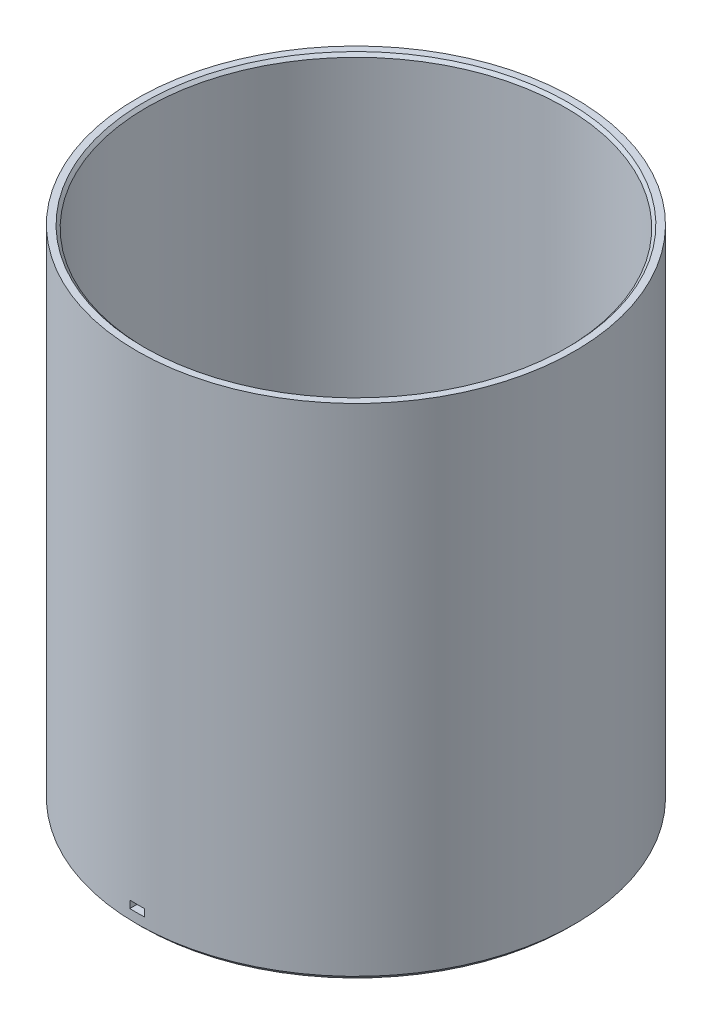
ISO-10303-21;
HEADER;
FILE_DESCRIPTION(('STEP AP214'),'2;1');
FILE_NAME('part.step','',(''),(''),'','','');
FILE_SCHEMA(('AUTOMOTIVE_DESIGN { 1 0 10303 214 1 1 1 1 }'));
ENDSEC;
DATA;
#1=APPLICATION_CONTEXT('core data for automotive mechanical design processes');
#2=APPLICATION_PROTOCOL_DEFINITION('international standard','automotive_design',2000,#1);
#3=PRODUCT_CONTEXT('',#1,'mechanical');
#4=PRODUCT('Part','Part','',(#3));
#5=PRODUCT_RELATED_PRODUCT_CATEGORY('part','',(#4));
#6=PRODUCT_DEFINITION_FORMATION('','',#4);
#7=PRODUCT_DEFINITION_CONTEXT('part definition',#1,'design');
#8=PRODUCT_DEFINITION('design','',#6,#7);
#9=PRODUCT_DEFINITION_SHAPE('','',#8);
#10=(LENGTH_UNIT() NAMED_UNIT(*) SI_UNIT(.MILLI.,.METRE.));
#11=(NAMED_UNIT(*) PLANE_ANGLE_UNIT() SI_UNIT($,.RADIAN.));
#12=(NAMED_UNIT(*) SI_UNIT($,.STERADIAN.) SOLID_ANGLE_UNIT());
#13=UNCERTAINTY_MEASURE_WITH_UNIT(LENGTH_MEASURE(1.E-05),#10,'distance_accuracy_value','');
#14=(GEOMETRIC_REPRESENTATION_CONTEXT(3) GLOBAL_UNCERTAINTY_ASSIGNED_CONTEXT((#13)) GLOBAL_UNIT_ASSIGNED_CONTEXT((#10,
#11,#12)) REPRESENTATION_CONTEXT('',''));
#15=CARTESIAN_POINT('',(0.,0.,0.));
#16=DIRECTION('',(0.,0.,1.));
#17=DIRECTION('',(1.,0.,0.));
#18=AXIS2_PLACEMENT_3D('',#15,#16,#17);
#19=CARTESIAN_POINT('',(0.,3.,0.));
#20=DIRECTION('',(0.,1.,0.));
#21=DIRECTION('',(0.,0.,1.));
#22=AXIS2_PLACEMENT_3D('',#19,#20,#21);
#23=PLANE('',#22);
#24=CARTESIAN_POINT('',(0.,3.,0.));
#25=DIRECTION('',(0.,1.,0.));
#26=DIRECTION('',(0.,0.,1.));
#27=AXIS2_PLACEMENT_3D('',#24,#25,#26);
#28=CIRCLE('',#27,43.);
#29=CARTESIAN_POINT('',(-1.5,3.,42.9738292452511));
#30=VERTEX_POINT('',#29);
#31=CARTESIAN_POINT('',(1.5,3.,42.9738292452511));
#32=VERTEX_POINT('',#31);
#33=EDGE_CURVE('E106',#30,#32,#28,.F.);
#34=ORIENTED_EDGE('',*,*,#33,.F.);
#35=DIRECTION('',(0.,0.,1.));
#36=VECTOR('',#35,1.);
#37=CARTESIAN_POINT('',(-1.5,3.,40.));
#38=LINE('',#37,#36);
#39=CARTESIAN_POINT('',(-1.5,3.,44.9749930516949));
#40=VERTEX_POINT('',#39);
#41=EDGE_CURVE('E212',#30,#40,#38,.T.);
#42=ORIENTED_EDGE('',*,*,#41,.T.);
#43=CARTESIAN_POINT('',(0.,3.,0.));
#44=DIRECTION('',(0.,-1.,0.));
#45=DIRECTION('',(0.,0.,-1.));
#46=AXIS2_PLACEMENT_3D('',#43,#44,#45);
#47=CIRCLE('',#46,45.);
#48=CARTESIAN_POINT('',(1.5,3.,44.9749930516949));
#49=VERTEX_POINT('',#48);
#50=EDGE_CURVE('E203',#49,#40,#47,.T.);
#51=ORIENTED_EDGE('',*,*,#50,.F.);
#52=DIRECTION('',(0.,0.,1.));
#53=VECTOR('',#52,1.);
#54=CARTESIAN_POINT('',(1.5,3.,40.));
#55=LINE('',#54,#53);
#56=EDGE_CURVE('E209',#32,#49,#55,.T.);
#57=ORIENTED_EDGE('',*,*,#56,.F.);
#58=EDGE_LOOP('',(#34,#42,#51,#57));
#59=FACE_BOUND('',#58,.T.);
#60=DIRECTION('',(0.,0.,1.));
#61=VECTOR('',#60,1.);
#62=CARTESIAN_POINT('',(1.5,3.,15.1760502107762));
#63=LINE('',#62,#61);
#64=CARTESIAN_POINT('',(1.5,3.,15.1760502107762));
#65=VERTEX_POINT('',#64);
#66=CARTESIAN_POINT('',(1.5,3.,17.1846588560844));
#67=VERTEX_POINT('',#66);
#68=EDGE_CURVE('E190',#65,#67,#63,.T.);
#69=ORIENTED_EDGE('',*,*,#68,.F.);
#70=CARTESIAN_POINT('',(0.,3.,0.));
#71=DIRECTION('',(0.,-1.,0.));
#72=DIRECTION('',(0.,0.,1.));
#73=AXIS2_PLACEMENT_3D('',#70,#71,#72);
#74=CIRCLE('',#73,15.25);
#75=CARTESIAN_POINT('',(-1.5,3.,15.1760502107762));
#76=VERTEX_POINT('',#75);
#77=EDGE_CURVE('E192',#76,#65,#74,.T.);
#78=ORIENTED_EDGE('',*,*,#77,.F.);
#79=DIRECTION('',(0.,0.,-1.));
#80=VECTOR('',#79,1.);
#81=CARTESIAN_POINT('',(-1.5,3.,15.1760502107762));
#82=LINE('',#81,#80);
#83=CARTESIAN_POINT('',(-1.5,3.,17.1846588560844));
#84=VERTEX_POINT('',#83);
#85=EDGE_CURVE('E185',#84,#76,#82,.T.);
#86=ORIENTED_EDGE('',*,*,#85,.F.);
#87=CARTESIAN_POINT('',(0.,3.,0.));
#88=DIRECTION('',(0.,1.,0.));
#89=DIRECTION('',(0.,0.,1.));
#90=AXIS2_PLACEMENT_3D('',#87,#88,#89);
#91=CIRCLE('',#90,17.25);
#92=EDGE_CURVE('E188',#67,#84,#91,.T.);
#93=ORIENTED_EDGE('',*,*,#92,.F.);
#94=EDGE_LOOP('',(#69,#78,#86,#93));
#95=FACE_BOUND('',#94,.T.);
#96=ADVANCED_FACE('F33',(#59,#95),#23,.T.);
#97=CARTESIAN_POINT('',(0.,3.,0.));
#98=DIRECTION('',(0.,-1.,0.));
#99=DIRECTION('',(0.,0.,-1.));
#100=AXIS2_PLACEMENT_3D('',#97,#98,#99);
#101=CYLINDRICAL_SURFACE('',#100,45.);
#102=CARTESIAN_POINT('',(0.,1.,0.));
#103=DIRECTION('',(0.,1.,0.));
#104=DIRECTION('',(0.,0.,1.));
#105=AXIS2_PLACEMENT_3D('',#102,#103,#104);
#106=CIRCLE('',#105,45.);
#107=CARTESIAN_POINT('',(0.,1.,45.));
#108=VERTEX_POINT('',#107);
#109=EDGE_CURVE('E41',#108,#108,#106,.T.);
#110=ORIENTED_EDGE('',*,*,#109,.T.);
#111=EDGE_LOOP('',(#110));
#112=FACE_BOUND('',#111,.T.);
#113=CARTESIAN_POINT('',(0.,4.5,0.));
#114=DIRECTION('',(0.,1.,0.));
#115=DIRECTION('',(0.,0.,1.));
#116=AXIS2_PLACEMENT_3D('',#113,#114,#115);
#117=CIRCLE('',#116,45.);
#118=CARTESIAN_POINT('',(-1.5,4.5,44.9749930516949));
#119=VERTEX_POINT('',#118);
#120=CARTESIAN_POINT('',(1.5,4.5,44.9749930516949));
#121=VERTEX_POINT('',#120);
#122=EDGE_CURVE('E208',#119,#121,#117,.T.);
#123=ORIENTED_EDGE('',*,*,#122,.T.);
#124=DIRECTION('',(0.,-1.,0.));
#125=VECTOR('',#124,1.);
#126=CARTESIAN_POINT('',(1.5,3.,44.9749930516949));
#127=LINE('',#126,#125);
#128=EDGE_CURVE('E115',#121,#49,#127,.T.);
#129=ORIENTED_EDGE('',*,*,#128,.T.);
#130=ORIENTED_EDGE('',*,*,#50,.T.);
#131=DIRECTION('',(0.,-1.,0.));
#132=VECTOR('',#131,1.);
#133=CARTESIAN_POINT('',(-1.5,3.,44.9749930516949));
#134=LINE('',#133,#132);
#135=EDGE_CURVE('E205',#40,#119,#134,.F.);
#136=ORIENTED_EDGE('',*,*,#135,.T.);
#137=EDGE_LOOP('',(#123,#129,#130,#136));
#138=FACE_BOUND('',#137,.T.);
#139=CARTESIAN_POINT('',(0.,103.,0.));
#140=DIRECTION('',(0.,1.,0.));
#141=DIRECTION('',(0.,0.,1.));
#142=AXIS2_PLACEMENT_3D('',#139,#140,#141);
#143=CIRCLE('',#142,45.);
#144=CARTESIAN_POINT('',(0.,103.,45.));
#145=VERTEX_POINT('',#144);
#146=EDGE_CURVE('E170',#145,#145,#143,.T.);
#147=ORIENTED_EDGE('',*,*,#146,.F.);
#148=EDGE_LOOP('',(#147));
#149=FACE_BOUND('',#148,.T.);
#150=ADVANCED_FACE('F131',(#112,#138,#149),#101,.T.);
#151=CARTESIAN_POINT('',(0.,0.,0.));
#152=DIRECTION('',(0.,1.,0.));
#153=DIRECTION('',(0.,0.,1.));
#154=AXIS2_PLACEMENT_3D('',#151,#152,#153);
#155=PLANE('',#154);
#156=CARTESIAN_POINT('',(0.,0.,0.));
#157=DIRECTION('',(0.,1.,0.));
#158=DIRECTION('',(0.,0.,1.));
#159=AXIS2_PLACEMENT_3D('',#156,#157,#158);
#160=CIRCLE('',#159,44.);
#161=CARTESIAN_POINT('',(0.,0.,44.));
#162=VERTEX_POINT('',#161);
#163=EDGE_CURVE('E11',#162,#162,#160,.F.);
#164=ORIENTED_EDGE('',*,*,#163,.T.);
#165=EDGE_LOOP('',(#164));
#166=FACE_BOUND('',#165,.T.);
#167=ADVANCED_FACE('F148',(#166),#155,.F.);
#168=CARTESIAN_POINT('',(0.,103.,0.));
#169=DIRECTION('',(0.,1.,0.));
#170=DIRECTION('',(0.,0.,1.));
#171=AXIS2_PLACEMENT_3D('',#168,#169,#170);
#172=PLANE('',#171);
#173=CARTESIAN_POINT('',(0.,103.,0.));
#174=DIRECTION('',(0.,1.,0.));
#175=DIRECTION('',(0.,0.,1.));
#176=AXIS2_PLACEMENT_3D('',#173,#174,#175);
#177=CIRCLE('',#176,43.6);
#178=CARTESIAN_POINT('',(0.,103.,43.6));
#179=VERTEX_POINT('',#178);
#180=EDGE_CURVE('E123',#179,#179,#177,.F.);
#181=ORIENTED_EDGE('',*,*,#180,.T.);
#182=EDGE_LOOP('',(#181));
#183=FACE_BOUND('',#182,.T.);
#184=ORIENTED_EDGE('',*,*,#146,.T.);
#185=EDGE_LOOP('',(#184));
#186=FACE_BOUND('',#185,.T.);
#187=ADVANCED_FACE('F153',(#183,#186),#172,.T.);
#188=CARTESIAN_POINT('',(0.,103.,0.));
#189=DIRECTION('',(0.,-1.,0.));
#190=DIRECTION('',(0.,0.,-1.));
#191=AXIS2_PLACEMENT_3D('',#188,#189,#190);
#192=CYLINDRICAL_SURFACE('',#191,43.);
#193=CARTESIAN_POINT('',(0.,102.4,0.));
#194=DIRECTION('',(0.,1.,0.));
#195=DIRECTION('',(0.,0.,1.));
#196=AXIS2_PLACEMENT_3D('',#193,#194,#195);
#197=CIRCLE('',#196,43.);
#198=CARTESIAN_POINT('',(0.,102.4,43.));
#199=VERTEX_POINT('',#198);
#200=EDGE_CURVE('E120',#199,#199,#197,.T.);
#201=ORIENTED_EDGE('',*,*,#200,.T.);
#202=EDGE_LOOP('',(#201));
#203=FACE_BOUND('',#202,.T.);
#204=DIRECTION('',(0.,-1.,0.));
#205=VECTOR('',#204,1.);
#206=CARTESIAN_POINT('',(1.49999999999999,103.,42.9738292452511));
#207=LINE('',#206,#205);
#208=CARTESIAN_POINT('',(1.5,4.5,42.9738292452511));
#209=VERTEX_POINT('',#208);
#210=EDGE_CURVE('E112',#209,#32,#207,.T.);
#211=ORIENTED_EDGE('',*,*,#210,.F.);
#212=CARTESIAN_POINT('',(0.,4.5,0.));
#213=DIRECTION('',(0.,1.,0.));
#214=DIRECTION('',(0.,0.,1.));
#215=AXIS2_PLACEMENT_3D('',#212,#213,#214);
#216=CIRCLE('',#215,43.);
#217=CARTESIAN_POINT('',(-1.5,4.5,42.9738292452511));
#218=VERTEX_POINT('',#217);
#219=EDGE_CURVE('E98',#218,#209,#216,.T.);
#220=ORIENTED_EDGE('',*,*,#219,.F.);
#221=DIRECTION('',(0.,-1.,0.));
#222=VECTOR('',#221,1.);
#223=CARTESIAN_POINT('',(-1.49999999999999,103.,42.9738292452511));
#224=LINE('',#223,#222);
#225=EDGE_CURVE('E105',#30,#218,#224,.F.);
#226=ORIENTED_EDGE('',*,*,#225,.F.);
#227=ORIENTED_EDGE('',*,*,#33,.T.);
#228=EDGE_LOOP('',(#211,#220,#226,#227));
#229=FACE_BOUND('',#228,.T.);
#230=ADVANCED_FACE('F118',(#203,#229),#192,.F.);
#231=CARTESIAN_POINT('',(0.,8.,0.));
#232=DIRECTION('',(0.,-1.,0.));
#233=DIRECTION('',(0.,0.,-1.));
#234=AXIS2_PLACEMENT_3D('',#231,#232,#233);
#235=CYLINDRICAL_SURFACE('',#234,15.25);
#236=ORIENTED_EDGE('',*,*,#77,.T.);
#237=DIRECTION('',(0.,-1.,0.));
#238=VECTOR('',#237,1.);
#239=CARTESIAN_POINT('',(1.5,8.,15.1760502107762));
#240=LINE('',#239,#238);
#241=CARTESIAN_POINT('',(1.5,8.,15.1760502107762));
#242=VERTEX_POINT('',#241);
#243=EDGE_CURVE('E172',#242,#65,#240,.T.);
#244=ORIENTED_EDGE('',*,*,#243,.F.);
#245=CARTESIAN_POINT('',(0.,8.,0.));
#246=DIRECTION('',(0.,-1.,0.));
#247=DIRECTION('',(0.,0.,1.));
#248=AXIS2_PLACEMENT_3D('',#245,#246,#247);
#249=CIRCLE('',#248,15.25);
#250=CARTESIAN_POINT('',(-1.5,8.,15.1760502107762));
#251=VERTEX_POINT('',#250);
#252=EDGE_CURVE('E187',#251,#242,#249,.T.);
#253=ORIENTED_EDGE('',*,*,#252,.F.);
#254=DIRECTION('',(0.,-1.,0.));
#255=VECTOR('',#254,1.);
#256=CARTESIAN_POINT('',(-1.5,8.,15.1760502107762));
#257=LINE('',#256,#255);
#258=EDGE_CURVE('E181',#251,#76,#257,.T.);
#259=ORIENTED_EDGE('',*,*,#258,.T.);
#260=EDGE_LOOP('',(#236,#244,#253,#259));
#261=FACE_BOUND('',#260,.T.);
#262=ADVANCED_FACE('F164',(#261),#235,.F.);
#263=CARTESIAN_POINT('',(1.5,8.,15.1760502107762));
#264=DIRECTION('',(1.,0.,0.));
#265=DIRECTION('',(0.,0.,-1.));
#266=AXIS2_PLACEMENT_3D('',#263,#264,#265);
#267=PLANE('',#266);
#268=ORIENTED_EDGE('',*,*,#68,.T.);
#269=DIRECTION('',(0.,-1.,0.));
#270=VECTOR('',#269,1.);
#271=CARTESIAN_POINT('',(1.5,8.,17.1846588560844));
#272=LINE('',#271,#270);
#273=CARTESIAN_POINT('',(1.5,8.,17.1846588560844));
#274=VERTEX_POINT('',#273);
#275=EDGE_CURVE('E175',#274,#67,#272,.T.);
#276=ORIENTED_EDGE('',*,*,#275,.F.);
#277=DIRECTION('',(0.,0.,1.));
#278=VECTOR('',#277,1.);
#279=CARTESIAN_POINT('',(1.5,8.,15.1760502107762));
#280=LINE('',#279,#278);
#281=EDGE_CURVE('E198',#242,#274,#280,.T.);
#282=ORIENTED_EDGE('',*,*,#281,.F.);
#283=ORIENTED_EDGE('',*,*,#243,.T.);
#284=EDGE_LOOP('',(#268,#276,#282,#283));
#285=FACE_BOUND('',#284,.T.);
#286=ADVANCED_FACE('F237',(#285),#267,.F.);
#287=CARTESIAN_POINT('',(0.,8.,0.));
#288=DIRECTION('',(0.,-1.,0.));
#289=DIRECTION('',(0.,0.,-1.));
#290=AXIS2_PLACEMENT_3D('',#287,#288,#289);
#291=CYLINDRICAL_SURFACE('',#290,17.25);
#292=ORIENTED_EDGE('',*,*,#92,.T.);
#293=DIRECTION('',(0.,-1.,0.));
#294=VECTOR('',#293,1.);
#295=CARTESIAN_POINT('',(-1.5,8.,17.1846588560844));
#296=LINE('',#295,#294);
#297=CARTESIAN_POINT('',(-1.5,8.,17.1846588560844));
#298=VERTEX_POINT('',#297);
#299=EDGE_CURVE('E56',#298,#84,#296,.T.);
#300=ORIENTED_EDGE('',*,*,#299,.F.);
#301=CARTESIAN_POINT('',(0.,8.,0.));
#302=DIRECTION('',(0.,1.,0.));
#303=DIRECTION('',(0.,0.,1.));
#304=AXIS2_PLACEMENT_3D('',#301,#302,#303);
#305=CIRCLE('',#304,17.25);
#306=EDGE_CURVE('E196',#274,#298,#305,.T.);
#307=ORIENTED_EDGE('',*,*,#306,.F.);
#308=ORIENTED_EDGE('',*,*,#275,.T.);
#309=EDGE_LOOP('',(#292,#300,#307,#308));
#310=FACE_BOUND('',#309,.T.);
#311=ADVANCED_FACE('F234',(#310),#291,.T.);
#312=CARTESIAN_POINT('',(-1.5,8.,15.1760502107762));
#313=DIRECTION('',(-1.,0.,0.));
#314=DIRECTION('',(0.,0.,1.));
#315=AXIS2_PLACEMENT_3D('',#312,#313,#314);
#316=PLANE('',#315);
#317=ORIENTED_EDGE('',*,*,#85,.T.);
#318=ORIENTED_EDGE('',*,*,#258,.F.);
#319=DIRECTION('',(0.,0.,-1.));
#320=VECTOR('',#319,1.);
#321=CARTESIAN_POINT('',(-1.5,8.,15.1760502107762));
#322=LINE('',#321,#320);
#323=EDGE_CURVE('E184',#298,#251,#322,.T.);
#324=ORIENTED_EDGE('',*,*,#323,.F.);
#325=ORIENTED_EDGE('',*,*,#299,.T.);
#326=EDGE_LOOP('',(#317,#318,#324,#325));
#327=FACE_BOUND('',#326,.T.);
#328=ADVANCED_FACE('F230',(#327),#316,.F.);
#329=CARTESIAN_POINT('',(0.,8.,0.));
#330=DIRECTION('',(0.,1.,0.));
#331=DIRECTION('',(0.,0.,1.));
#332=AXIS2_PLACEMENT_3D('',#329,#330,#331);
#333=PLANE('',#332);
#334=ORIENTED_EDGE('',*,*,#252,.T.);
#335=ORIENTED_EDGE('',*,*,#281,.T.);
#336=ORIENTED_EDGE('',*,*,#306,.T.);
#337=ORIENTED_EDGE('',*,*,#323,.T.);
#338=EDGE_LOOP('',(#334,#335,#336,#337));
#339=FACE_BOUND('',#338,.T.);
#340=ADVANCED_FACE('F225',(#339),#333,.T.);
#341=CARTESIAN_POINT('',(1.5,4.5,40.));
#342=DIRECTION('',(1.,0.,0.));
#343=DIRECTION('',(0.,1.,0.));
#344=AXIS2_PLACEMENT_3D('',#341,#342,#343);
#345=PLANE('',#344);
#346=DIRECTION('',(0.,0.,1.));
#347=VECTOR('',#346,1.);
#348=CARTESIAN_POINT('',(1.5,4.5,40.));
#349=LINE('',#348,#347);
#350=EDGE_CURVE('E101',#209,#121,#349,.T.);
#351=ORIENTED_EDGE('',*,*,#350,.F.);
#352=ORIENTED_EDGE('',*,*,#210,.T.);
#353=ORIENTED_EDGE('',*,*,#56,.T.);
#354=ORIENTED_EDGE('',*,*,#128,.F.);
#355=EDGE_LOOP('',(#351,#352,#353,#354));
#356=FACE_BOUND('',#355,.T.);
#357=ADVANCED_FACE('F110',(#356),#345,.F.);
#358=CARTESIAN_POINT('',(-1.5,4.5,40.));
#359=DIRECTION('',(-1.,0.,0.));
#360=DIRECTION('',(0.,-1.,0.));
#361=AXIS2_PLACEMENT_3D('',#358,#359,#360);
#362=PLANE('',#361);
#363=ORIENTED_EDGE('',*,*,#41,.F.);
#364=ORIENTED_EDGE('',*,*,#225,.T.);
#365=DIRECTION('',(0.,0.,1.));
#366=VECTOR('',#365,1.);
#367=CARTESIAN_POINT('',(-1.5,4.5,40.));
#368=LINE('',#367,#366);
#369=EDGE_CURVE('E48',#218,#119,#368,.T.);
#370=ORIENTED_EDGE('',*,*,#369,.T.);
#371=ORIENTED_EDGE('',*,*,#135,.F.);
#372=EDGE_LOOP('',(#363,#364,#370,#371));
#373=FACE_BOUND('',#372,.T.);
#374=ADVANCED_FACE('F217',(#373),#362,.F.);
#375=CARTESIAN_POINT('',(-1.5,4.5,40.));
#376=DIRECTION('',(0.,1.,0.));
#377=DIRECTION('',(0.,0.,1.));
#378=AXIS2_PLACEMENT_3D('',#375,#376,#377);
#379=PLANE('',#378);
#380=ORIENTED_EDGE('',*,*,#122,.F.);
#381=ORIENTED_EDGE('',*,*,#369,.F.);
#382=ORIENTED_EDGE('',*,*,#219,.T.);
#383=ORIENTED_EDGE('',*,*,#350,.T.);
#384=EDGE_LOOP('',(#380,#381,#382,#383));
#385=FACE_BOUND('',#384,.T.);
#386=ADVANCED_FACE('F100',(#385),#379,.F.);
#387=CARTESIAN_POINT('',(0.,102.4,0.));
#388=DIRECTION('',(0.,1.,0.));
#389=DIRECTION('',(0.,0.,1.));
#390=AXIS2_PLACEMENT_3D('',#387,#388,#389);
#391=CONICAL_SURFACE('',#390,43.,0.785398163397443);
#392=ORIENTED_EDGE('',*,*,#180,.F.);
#393=EDGE_LOOP('',(#392));
#394=FACE_BOUND('',#393,.T.);
#395=ORIENTED_EDGE('',*,*,#200,.F.);
#396=EDGE_LOOP('',(#395));
#397=FACE_BOUND('',#396,.T.);
#398=ADVANCED_FACE('F135',(#394,#397),#391,.F.);
#399=CARTESIAN_POINT('',(0.,1.,0.));
#400=DIRECTION('',(0.,1.,0.));
#401=DIRECTION('',(0.,0.,1.));
#402=AXIS2_PLACEMENT_3D('',#399,#400,#401);
#403=CONICAL_SURFACE('',#402,45.,0.785398163397455);
#404=ORIENTED_EDGE('',*,*,#163,.F.);
#405=EDGE_LOOP('',(#404));
#406=FACE_BOUND('',#405,.T.);
#407=ORIENTED_EDGE('',*,*,#109,.F.);
#408=EDGE_LOOP('',(#407));
#409=FACE_BOUND('',#408,.T.);
#410=ADVANCED_FACE('F35',(#406,#409),#403,.T.);
#411=CLOSED_SHELL('',(#96,#150,#167,#187,#230,#262,#286,#311,#328,#340,#357,#374,#386,#398,#410));
#412=MANIFOLD_SOLID_BREP('B2',#411);
#413=ADVANCED_BREP_SHAPE_REPRESENTATION('',(#18,#412),#14);
#414=SHAPE_DEFINITION_REPRESENTATION(#9,#413);
ENDSEC;
END-ISO-10303-21;
